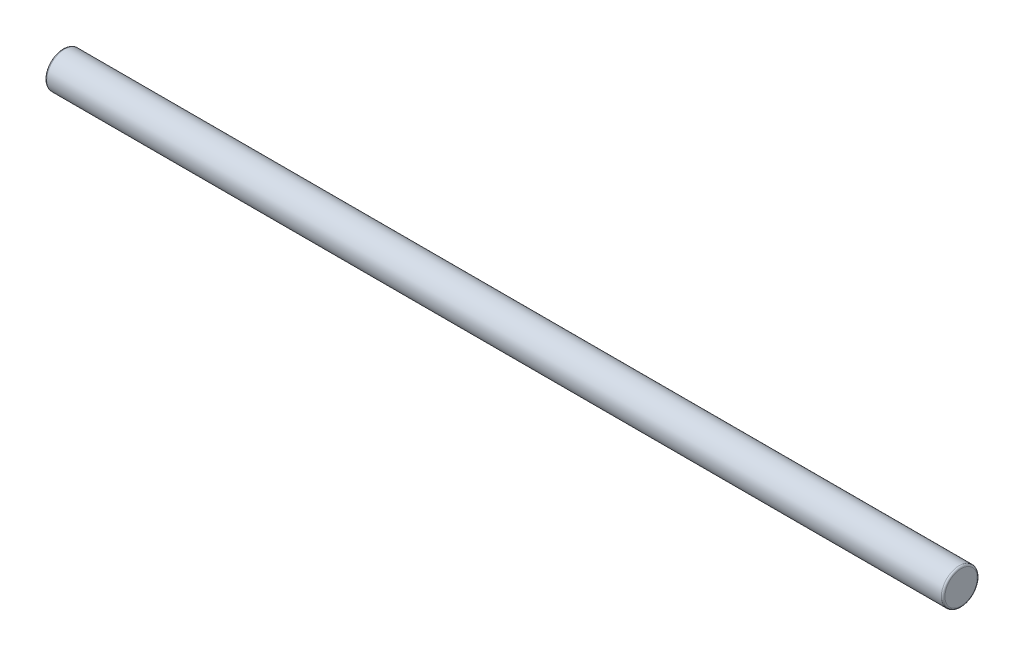
ISO-10303-21;
HEADER;
FILE_DESCRIPTION(('STEP AP214'),'2;1');
FILE_NAME('part.step','',(''),(''),'','','');
FILE_SCHEMA(('AUTOMOTIVE_DESIGN { 1 0 10303 214 1 1 1 1 }'));
ENDSEC;
DATA;
#1=APPLICATION_CONTEXT('core data for automotive mechanical design processes');
#2=APPLICATION_PROTOCOL_DEFINITION('international standard','automotive_design',2000,#1);
#3=PRODUCT_CONTEXT('',#1,'mechanical');
#4=PRODUCT('Part','Part','',(#3));
#5=PRODUCT_RELATED_PRODUCT_CATEGORY('part','',(#4));
#6=PRODUCT_DEFINITION_FORMATION('','',#4);
#7=PRODUCT_DEFINITION_CONTEXT('part definition',#1,'design');
#8=PRODUCT_DEFINITION('design','',#6,#7);
#9=PRODUCT_DEFINITION_SHAPE('','',#8);
#10=(LENGTH_UNIT() NAMED_UNIT(*) SI_UNIT(.MILLI.,.METRE.));
#11=(NAMED_UNIT(*) PLANE_ANGLE_UNIT() SI_UNIT($,.RADIAN.));
#12=(NAMED_UNIT(*) SI_UNIT($,.STERADIAN.) SOLID_ANGLE_UNIT());
#13=UNCERTAINTY_MEASURE_WITH_UNIT(LENGTH_MEASURE(1.E-05),#10,'distance_accuracy_value','');
#14=(GEOMETRIC_REPRESENTATION_CONTEXT(3) GLOBAL_UNCERTAINTY_ASSIGNED_CONTEXT((#13)) GLOBAL_UNIT_ASSIGNED_CONTEXT((#10,
#11,#12)) REPRESENTATION_CONTEXT('',''));
#15=CARTESIAN_POINT('',(0.,0.,0.));
#16=DIRECTION('',(0.,0.,1.));
#17=DIRECTION('',(1.,0.,0.));
#18=AXIS2_PLACEMENT_3D('',#15,#16,#17);
#19=CARTESIAN_POINT('',(250.,0.,0.));
#20=DIRECTION('',(-1.,0.,0.));
#21=DIRECTION('',(0.,0.,1.));
#22=AXIS2_PLACEMENT_3D('',#19,#20,#21);
#23=CYLINDRICAL_SURFACE('',#22,10.);
#24=CARTESIAN_POINT('',(-249.,0.,0.));
#25=DIRECTION('',(1.,0.,0.));
#26=DIRECTION('',(0.,0.,-1.));
#27=AXIS2_PLACEMENT_3D('',#24,#25,#26);
#28=CIRCLE('',#27,10.);
#29=CARTESIAN_POINT('',(-249.,0.,-10.));
#30=VERTEX_POINT('',#29);
#31=EDGE_CURVE('E42',#30,#30,#28,.T.);
#32=ORIENTED_EDGE('',*,*,#31,.T.);
#33=EDGE_LOOP('',(#32));
#34=FACE_BOUND('',#33,.T.);
#35=CARTESIAN_POINT('',(249.,0.,0.));
#36=DIRECTION('',(1.,0.,0.));
#37=DIRECTION('',(0.,0.,-1.));
#38=AXIS2_PLACEMENT_3D('',#35,#36,#37);
#39=CIRCLE('',#38,10.);
#40=CARTESIAN_POINT('',(249.,0.,-10.));
#41=VERTEX_POINT('',#40);
#42=EDGE_CURVE('E46',#41,#41,#39,.F.);
#43=ORIENTED_EDGE('',*,*,#42,.T.);
#44=EDGE_LOOP('',(#43));
#45=FACE_BOUND('',#44,.T.);
#46=ADVANCED_FACE('F31',(#34,#45),#23,.T.);
#47=CARTESIAN_POINT('',(250.,0.,0.));
#48=DIRECTION('',(1.,0.,0.));
#49=DIRECTION('',(0.,0.,-1.));
#50=AXIS2_PLACEMENT_3D('',#47,#48,#49);
#51=PLANE('',#50);
#52=CARTESIAN_POINT('',(250.,0.,0.));
#53=DIRECTION('',(1.,0.,0.));
#54=DIRECTION('',(0.,0.,-1.));
#55=AXIS2_PLACEMENT_3D('',#52,#53,#54);
#56=CIRCLE('',#55,9.);
#57=CARTESIAN_POINT('',(250.,0.,-9.));
#58=VERTEX_POINT('',#57);
#59=EDGE_CURVE('E10',#58,#58,#56,.T.);
#60=ORIENTED_EDGE('',*,*,#59,.T.);
#61=EDGE_LOOP('',(#60));
#62=FACE_BOUND('',#61,.T.);
#63=ADVANCED_FACE('F62',(#62),#51,.T.);
#64=CARTESIAN_POINT('',(-250.,0.,0.));
#65=DIRECTION('',(1.,0.,0.));
#66=DIRECTION('',(0.,0.,-1.));
#67=AXIS2_PLACEMENT_3D('',#64,#65,#66);
#68=PLANE('',#67);
#69=CARTESIAN_POINT('',(-250.,0.,0.));
#70=DIRECTION('',(1.,0.,0.));
#71=DIRECTION('',(0.,0.,-1.));
#72=AXIS2_PLACEMENT_3D('',#69,#70,#71);
#73=CIRCLE('',#72,9.);
#74=CARTESIAN_POINT('',(-250.,0.,-9.));
#75=VERTEX_POINT('',#74);
#76=EDGE_CURVE('E38',#75,#75,#73,.F.);
#77=ORIENTED_EDGE('',*,*,#76,.T.);
#78=EDGE_LOOP('',(#77));
#79=FACE_BOUND('',#78,.T.);
#80=ADVANCED_FACE('F59',(#79),#68,.F.);
#81=CARTESIAN_POINT('',(-249.,0.,0.));
#82=DIRECTION('',(1.,0.,0.));
#83=DIRECTION('',(0.,0.,-1.));
#84=AXIS2_PLACEMENT_3D('',#81,#82,#83);
#85=TOROIDAL_SURFACE('',#84,9.,1.);
#86=ORIENTED_EDGE('',*,*,#76,.F.);
#87=EDGE_LOOP('',(#86));
#88=FACE_BOUND('',#87,.T.);
#89=ORIENTED_EDGE('',*,*,#31,.F.);
#90=EDGE_LOOP('',(#89));
#91=FACE_BOUND('',#90,.T.);
#92=ADVANCED_FACE('F55',(#88,#91),#85,.T.);
#93=CARTESIAN_POINT('',(249.,0.,0.));
#94=DIRECTION('',(1.,0.,0.));
#95=DIRECTION('',(0.,0.,-1.));
#96=AXIS2_PLACEMENT_3D('',#93,#94,#95);
#97=TOROIDAL_SURFACE('',#96,9.,1.);
#98=ORIENTED_EDGE('',*,*,#42,.F.);
#99=EDGE_LOOP('',(#98));
#100=FACE_BOUND('',#99,.T.);
#101=ORIENTED_EDGE('',*,*,#59,.F.);
#102=EDGE_LOOP('',(#101));
#103=FACE_BOUND('',#102,.T.);
#104=ADVANCED_FACE('F33',(#100,#103),#97,.T.);
#105=CLOSED_SHELL('',(#46,#63,#80,#92,#104));
#106=MANIFOLD_SOLID_BREP('B2',#105);
#107=ADVANCED_BREP_SHAPE_REPRESENTATION('',(#18,#106),#14);
#108=SHAPE_DEFINITION_REPRESENTATION(#9,#107);
ENDSEC;
END-ISO-10303-21;
